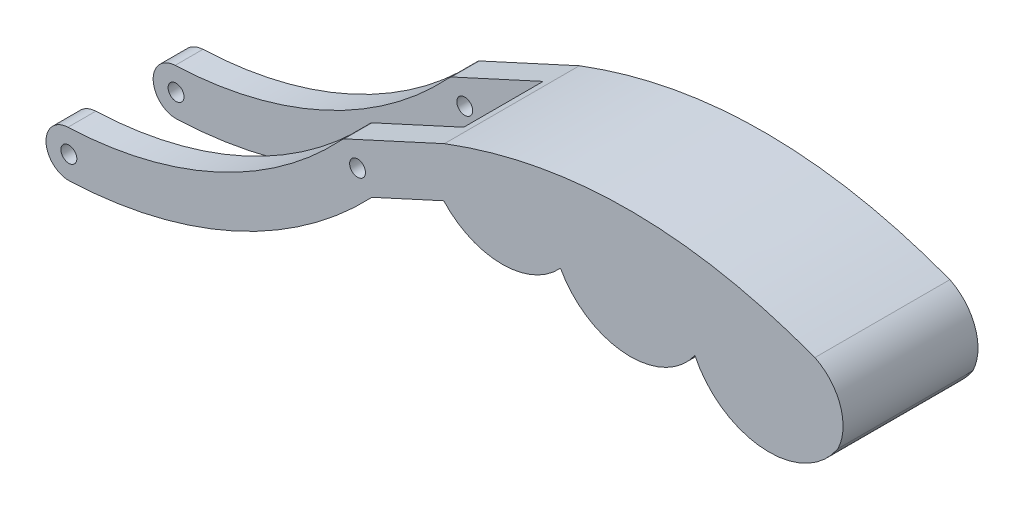
ISO-10303-21;
HEADER;
FILE_DESCRIPTION(('STEP AP214'),'2;1');
FILE_NAME('part.step','',(''),(''),'','','');
FILE_SCHEMA(('AUTOMOTIVE_DESIGN { 1 0 10303 214 1 1 1 1 }'));
ENDSEC;
DATA;
#1=APPLICATION_CONTEXT('core data for automotive mechanical design processes');
#2=APPLICATION_PROTOCOL_DEFINITION('international standard','automotive_design',2000,#1);
#3=PRODUCT_CONTEXT('',#1,'mechanical');
#4=PRODUCT('Part','Part','',(#3));
#5=PRODUCT_RELATED_PRODUCT_CATEGORY('part','',(#4));
#6=PRODUCT_DEFINITION_FORMATION('','',#4);
#7=PRODUCT_DEFINITION_CONTEXT('part definition',#1,'design');
#8=PRODUCT_DEFINITION('design','',#6,#7);
#9=PRODUCT_DEFINITION_SHAPE('','',#8);
#10=(LENGTH_UNIT() NAMED_UNIT(*) SI_UNIT(.MILLI.,.METRE.));
#11=(NAMED_UNIT(*) PLANE_ANGLE_UNIT() SI_UNIT($,.RADIAN.));
#12=(NAMED_UNIT(*) SI_UNIT($,.STERADIAN.) SOLID_ANGLE_UNIT());
#13=UNCERTAINTY_MEASURE_WITH_UNIT(LENGTH_MEASURE(1.E-05),#10,'distance_accuracy_value','');
#14=(GEOMETRIC_REPRESENTATION_CONTEXT(3) GLOBAL_UNCERTAINTY_ASSIGNED_CONTEXT((#13)) GLOBAL_UNIT_ASSIGNED_CONTEXT((#10,
#11,#12)) REPRESENTATION_CONTEXT('',''));
#15=CARTESIAN_POINT('',(0.,0.,0.));
#16=DIRECTION('',(0.,0.,1.));
#17=DIRECTION('',(1.,0.,0.));
#18=AXIS2_PLACEMENT_3D('',#15,#16,#17);
#19=CARTESIAN_POINT('',(-6.29132392811438,157.726048310342,51.));
#20=DIRECTION('',(0.,0.,-1.));
#21=DIRECTION('',(-0.999999999999998,0.,0.));
#22=AXIS2_PLACEMENT_3D('',#19,#20,#21);
#23=CYLINDRICAL_SURFACE('',#22,149.202972959832);
#24=CARTESIAN_POINT('',(-6.29132392811438,157.726048310342,40.5));
#25=DIRECTION('',(0.,0.,1.));
#26=DIRECTION('',(0.999999999999998,0.,0.));
#27=AXIS2_PLACEMENT_3D('',#24,#25,#26);
#28=CIRCLE('',#27,149.202972959832);
#29=CARTESIAN_POINT('',(-0.344694323235806,8.64162680227676,40.5));
#30=VERTEX_POINT('',#29);
#31=CARTESIAN_POINT('',(102.765670288736,55.9021849361896,40.5));
#32=VERTEX_POINT('',#31);
#33=EDGE_CURVE('E281',#30,#32,#28,.T.);
#34=ORIENTED_EDGE('',*,*,#33,.F.);
#35=DIRECTION('',(0.,0.,-1.));
#36=VECTOR('',#35,1.);
#37=CARTESIAN_POINT('',(-0.344694323235806,8.64162680227676,51.));
#38=LINE('',#37,#36);
#39=CARTESIAN_POINT('',(-0.344694323235806,8.64162680227676,51.));
#40=VERTEX_POINT('',#39);
#41=EDGE_CURVE('E56',#40,#30,#38,.T.);
#42=ORIENTED_EDGE('',*,*,#41,.F.);
#43=CARTESIAN_POINT('',(-6.29132392811438,157.726048310342,51.));
#44=DIRECTION('',(0.,0.,1.));
#45=DIRECTION('',(0.999999999999998,0.,0.));
#46=AXIS2_PLACEMENT_3D('',#43,#44,#45);
#47=CIRCLE('',#46,149.202972959832);
#48=CARTESIAN_POINT('',(102.765670288736,55.9021849361896,51.));
#49=VERTEX_POINT('',#48);
#50=EDGE_CURVE('E226',#40,#49,#47,.T.);
#51=ORIENTED_EDGE('',*,*,#50,.T.);
#52=DIRECTION('',(0.,0.,-1.));
#53=VECTOR('',#52,1.);
#54=CARTESIAN_POINT('',(102.765670288736,55.9021849361896,51.));
#55=LINE('',#54,#53);
#56=EDGE_CURVE('E227',#49,#32,#55,.T.);
#57=ORIENTED_EDGE('',*,*,#56,.T.);
#58=EDGE_LOOP('',(#34,#42,#51,#57));
#59=FACE_BOUND('',#58,.T.);
#60=ADVANCED_FACE('F48',(#59),#23,.F.);
#61=CARTESIAN_POINT('',(-1.11022302462516E-13,-2.22044604925031E-13,51.));
#62=DIRECTION('',(0.,0.,-1.));
#63=DIRECTION('',(-0.999999999999998,0.,0.));
#64=AXIS2_PLACEMENT_3D('',#61,#62,#63);
#65=CYLINDRICAL_SURFACE('',#64,8.64849859607463);
#66=ORIENTED_EDGE('',*,*,#41,.T.);
#67=CARTESIAN_POINT('',(-1.11022302462516E-13,-2.22044604925031E-13,40.5));
#68=DIRECTION('',(0.,0.,1.));
#69=DIRECTION('',(0.999999999999998,0.,0.));
#70=AXIS2_PLACEMENT_3D('',#67,#68,#69);
#71=CIRCLE('',#70,8.64849859607463);
#72=CARTESIAN_POINT('',(0.344694323235806,-8.64162680227731,40.5));
#73=VERTEX_POINT('',#72);
#74=EDGE_CURVE('E284',#30,#73,#71,.T.);
#75=ORIENTED_EDGE('',*,*,#74,.T.);
#76=DIRECTION('',(0.,0.,-1.));
#77=VECTOR('',#76,1.);
#78=CARTESIAN_POINT('',(0.344694323235806,-8.64162680227731,51.));
#79=LINE('',#78,#77);
#80=CARTESIAN_POINT('',(0.344694323235806,-8.64162680227731,51.));
#81=VERTEX_POINT('',#80);
#82=EDGE_CURVE('E251',#81,#73,#79,.T.);
#83=ORIENTED_EDGE('',*,*,#82,.F.);
#84=CARTESIAN_POINT('',(-1.11022302462516E-13,-2.22044604925031E-13,51.));
#85=DIRECTION('',(0.,0.,1.));
#86=DIRECTION('',(0.999999999999998,0.,0.));
#87=AXIS2_PLACEMENT_3D('',#84,#85,#86);
#88=CIRCLE('',#87,8.64849859607463);
#89=EDGE_CURVE('E302',#40,#81,#88,.T.);
#90=ORIENTED_EDGE('',*,*,#89,.F.);
#91=EDGE_LOOP('',(#66,#75,#83,#90));
#92=FACE_BOUND('',#91,.T.);
#93=ADVANCED_FACE('F382',(#92),#65,.T.);
#94=CARTESIAN_POINT('',(-6.29132392811438,157.726048310342,51.));
#95=DIRECTION('',(0.,0.,-1.));
#96=DIRECTION('',(-0.999999999999998,0.,0.));
#97=AXIS2_PLACEMENT_3D('',#94,#95,#96);
#98=CYLINDRICAL_SURFACE('',#97,166.499970151981);
#99=ORIENTED_EDGE('',*,*,#82,.T.);
#100=CARTESIAN_POINT('',(-6.29132392811438,157.726048310342,40.5));
#101=DIRECTION('',(0.,0.,1.));
#102=DIRECTION('',(0.999999999999998,0.,0.));
#103=AXIS2_PLACEMENT_3D('',#100,#101,#102);
#104=CIRCLE('',#103,166.499970151981);
#105=CARTESIAN_POINT('',(114.496565446833,43.1288151807596,40.5));
#106=VERTEX_POINT('',#105);
#107=EDGE_CURVE('E287',#73,#106,#104,.T.);
#108=ORIENTED_EDGE('',*,*,#107,.T.);
#109=DIRECTION('',(0.,0.,-1.));
#110=VECTOR('',#109,1.);
#111=CARTESIAN_POINT('',(114.496565446833,43.1288151807596,51.));
#112=LINE('',#111,#110);
#113=CARTESIAN_POINT('',(114.496565446833,43.1288151807596,51.));
#114=VERTEX_POINT('',#113);
#115=EDGE_CURVE('E247',#114,#106,#112,.T.);
#116=ORIENTED_EDGE('',*,*,#115,.F.);
#117=CARTESIAN_POINT('',(-6.29132392811438,157.726048310342,51.));
#118=DIRECTION('',(0.,0.,1.));
#119=DIRECTION('',(0.999999999999998,0.,0.));
#120=AXIS2_PLACEMENT_3D('',#117,#118,#119);
#121=CIRCLE('',#120,166.499970151981);
#122=EDGE_CURVE('E304',#81,#114,#121,.T.);
#123=ORIENTED_EDGE('',*,*,#122,.F.);
#124=EDGE_LOOP('',(#99,#108,#116,#123));
#125=FACE_BOUND('',#124,.T.);
#126=ADVANCED_FACE('F386',(#125),#98,.T.);
#127=CARTESIAN_POINT('',(3.54177078409457,-7.72723157194322,51.));
#128=DIRECTION('',(-0.416666666666664,0.909059342886308,0.));
#129=DIRECTION('',(-0.909059342886308,-0.416666666666664,0.));
#130=AXIS2_PLACEMENT_3D('',#127,#128,#129);
#131=PLANE('',#130);
#132=ORIENTED_EDGE('',*,*,#115,.T.);
#133=DIRECTION('',(0.909059342886308,0.416666666666664,0.));
#134=VECTOR('',#133,1.);
#135=CARTESIAN_POINT('',(3.54177078409457,-7.72723157194322,40.5));
#136=LINE('',#135,#134);
#137=CARTESIAN_POINT('',(141.660745716672,55.5794967939418,40.5));
#138=VERTEX_POINT('',#137);
#139=EDGE_CURVE('E290',#106,#138,#136,.T.);
#140=ORIENTED_EDGE('',*,*,#139,.T.);
#141=DIRECTION('',(0.,0.,-1.));
#142=VECTOR('',#141,1.);
#143=CARTESIAN_POINT('',(141.660745716672,55.5794967939418,51.));
#144=LINE('',#143,#142);
#145=CARTESIAN_POINT('',(141.660745716672,55.5794967939418,51.));
#146=VERTEX_POINT('',#145);
#147=EDGE_CURVE('E243',#146,#138,#144,.T.);
#148=ORIENTED_EDGE('',*,*,#147,.F.);
#149=DIRECTION('',(0.909059342886308,0.416666666666664,0.));
#150=VECTOR('',#149,1.);
#151=CARTESIAN_POINT('',(3.54177078409457,-7.72723157194322,51.));
#152=LINE('',#151,#150);
#153=EDGE_CURVE('E306',#114,#146,#152,.T.);
#154=ORIENTED_EDGE('',*,*,#153,.F.);
#155=EDGE_LOOP('',(#132,#140,#148,#154));
#156=FACE_BOUND('',#155,.T.);
#157=ADVANCED_FACE('F433',(#156),#131,.F.);
#158=CARTESIAN_POINT('',(0.,0.,51.));
#159=DIRECTION('',(0.,0.,-1.));
#160=DIRECTION('',(-0.999999999999998,0.,0.));
#161=AXIS2_PLACEMENT_3D('',#158,#159,#160);
#162=CYLINDRICAL_SURFACE('',#161,3.00000000000001);
#163=CARTESIAN_POINT('',(0.,0.,40.5));
#164=DIRECTION('',(0.,0.,1.));
#165=DIRECTION('',(0.999999999999998,0.,0.));
#166=AXIS2_PLACEMENT_3D('',#163,#164,#165);
#167=CIRCLE('',#166,3.00000000000001);
#168=CARTESIAN_POINT('',(3.,0.,40.5));
#169=VERTEX_POINT('',#168);
#170=EDGE_CURVE('E296',#169,#169,#167,.T.);
#171=ORIENTED_EDGE('',*,*,#170,.F.);
#172=EDGE_LOOP('',(#171));
#173=FACE_BOUND('',#172,.T.);
#174=CARTESIAN_POINT('',(0.,0.,51.));
#175=DIRECTION('',(0.,0.,1.));
#176=DIRECTION('',(0.999999999999998,0.,0.));
#177=AXIS2_PLACEMENT_3D('',#174,#175,#176);
#178=CIRCLE('',#177,3.00000000000001);
#179=CARTESIAN_POINT('',(3.,0.,51.));
#180=VERTEX_POINT('',#179);
#181=EDGE_CURVE('E176',#180,#180,#178,.T.);
#182=ORIENTED_EDGE('',*,*,#181,.T.);
#183=EDGE_LOOP('',(#182));
#184=FACE_BOUND('',#183,.T.);
#185=ADVANCED_FACE('F465',(#173,#184),#162,.F.);
#186=CARTESIAN_POINT('',(109.087121146357,49.9999999999995,51.));
#187=DIRECTION('',(0.,0.,-1.));
#188=DIRECTION('',(-0.999999999999998,0.,0.));
#189=AXIS2_PLACEMENT_3D('',#186,#187,#188);
#190=CYLINDRICAL_SURFACE('',#189,8.64849859607463);
#191=DIRECTION('',(0.,0.,-1.));
#192=VECTOR('',#191,1.);
#193=CARTESIAN_POINT('',(104.095898095928,57.0628762149119,51.));
#194=LINE('',#193,#192);
#195=CARTESIAN_POINT('',(104.095898095928,57.0628762149119,51.));
#196=VERTEX_POINT('',#195);
#197=CARTESIAN_POINT('',(104.095898095928,57.0628762149119,40.5));
#198=VERTEX_POINT('',#197);
#199=EDGE_CURVE('E163',#196,#198,#194,.T.);
#200=ORIENTED_EDGE('',*,*,#199,.T.);
#201=CARTESIAN_POINT('',(109.087121146357,49.9999999999995,40.5));
#202=DIRECTION('',(0.,0.,1.));
#203=DIRECTION('',(0.999999999999998,0.,0.));
#204=AXIS2_PLACEMENT_3D('',#201,#202,#203);
#205=CIRCLE('',#204,8.64849859607463);
#206=EDGE_CURVE('E262',#198,#32,#205,.T.);
#207=ORIENTED_EDGE('',*,*,#206,.T.);
#208=ORIENTED_EDGE('',*,*,#56,.F.);
#209=CARTESIAN_POINT('',(109.087121146357,49.9999999999995,51.));
#210=DIRECTION('',(0.,0.,1.));
#211=DIRECTION('',(0.999999999999998,0.,0.));
#212=AXIS2_PLACEMENT_3D('',#209,#210,#211);
#213=CIRCLE('',#212,8.64849859607463);
#214=EDGE_CURVE('E72',#196,#49,#213,.T.);
#215=ORIENTED_EDGE('',*,*,#214,.F.);
#216=EDGE_LOOP('',(#200,#207,#208,#215));
#217=FACE_BOUND('',#216,.T.);
#218=ADVANCED_FACE('F396',(#217),#190,.T.);
#219=CARTESIAN_POINT('',(109.087121146357,49.9999999999994,51.));
#220=DIRECTION('',(0.,0.,-1.));
#221=DIRECTION('',(-0.999999999999998,0.,0.));
#222=AXIS2_PLACEMENT_3D('',#219,#220,#221);
#223=CYLINDRICAL_SURFACE('',#222,3.00000000000001);
#224=CARTESIAN_POINT('',(109.087121146357,49.9999999999994,40.5));
#225=DIRECTION('',(0.,0.,1.));
#226=DIRECTION('',(0.999999999999998,0.,0.));
#227=AXIS2_PLACEMENT_3D('',#224,#225,#226);
#228=CIRCLE('',#227,3.00000000000001);
#229=CARTESIAN_POINT('',(112.087121146357,49.9999999999994,40.5));
#230=VERTEX_POINT('',#229);
#231=EDGE_CURVE('E260',#230,#230,#228,.T.);
#232=ORIENTED_EDGE('',*,*,#231,.F.);
#233=EDGE_LOOP('',(#232));
#234=FACE_BOUND('',#233,.T.);
#235=CARTESIAN_POINT('',(109.087121146357,49.9999999999994,51.));
#236=DIRECTION('',(0.,0.,1.));
#237=DIRECTION('',(0.999999999999998,0.,0.));
#238=AXIS2_PLACEMENT_3D('',#235,#236,#237);
#239=CIRCLE('',#238,3.00000000000001);
#240=CARTESIAN_POINT('',(112.087121146357,49.9999999999994,51.));
#241=VERTEX_POINT('',#240);
#242=EDGE_CURVE('E185',#241,#241,#239,.T.);
#243=ORIENTED_EDGE('',*,*,#242,.T.);
#244=EDGE_LOOP('',(#243));
#245=FACE_BOUND('',#244,.T.);
#246=ADVANCED_FACE('F390',(#234,#245),#223,.F.);
#247=CARTESIAN_POINT('',(-6.29132392811438,157.726048310342,10.5));
#248=DIRECTION('',(0.,0.,-1.));
#249=DIRECTION('',(-0.999999999999998,0.,0.));
#250=AXIS2_PLACEMENT_3D('',#247,#248,#249);
#251=CIRCLE('',#250,149.202972959832);
#252=CARTESIAN_POINT('',(102.765670288736,55.9021849361896,10.5));
#253=VERTEX_POINT('',#252);
#254=CARTESIAN_POINT('',(-0.344694323235806,8.64162680227676,10.5));
#255=VERTEX_POINT('',#254);
#256=EDGE_CURVE('E335',#253,#255,#251,.T.);
#257=ORIENTED_EDGE('',*,*,#256,.F.);
#258=CARTESIAN_POINT('',(102.765670288736,55.9021849361896,0.));
#259=VERTEX_POINT('',#258);
#260=EDGE_CURVE('E116',#253,#259,#55,.T.);
#261=ORIENTED_EDGE('',*,*,#260,.T.);
#262=CARTESIAN_POINT('',(-6.29132392811438,157.726048310342,0.));
#263=DIRECTION('',(0.,0.,1.));
#264=DIRECTION('',(0.999999999999998,0.,0.));
#265=AXIS2_PLACEMENT_3D('',#262,#263,#264);
#266=CIRCLE('',#265,149.202972959832);
#267=CARTESIAN_POINT('',(-0.344694323235806,8.64162680227676,0.));
#268=VERTEX_POINT('',#267);
#269=EDGE_CURVE('E188',#268,#259,#266,.T.);
#270=ORIENTED_EDGE('',*,*,#269,.F.);
#271=EDGE_CURVE('E254',#255,#268,#38,.T.);
#272=ORIENTED_EDGE('',*,*,#271,.F.);
#273=EDGE_LOOP('',(#257,#261,#270,#272));
#274=FACE_BOUND('',#273,.T.);
#275=ADVANCED_FACE('F50',(#274),#23,.F.);
#276=CARTESIAN_POINT('',(0.344694323235806,-8.64162680227731,10.5));
#277=VERTEX_POINT('',#276);
#278=CARTESIAN_POINT('',(0.344694323235806,-8.64162680227731,0.));
#279=VERTEX_POINT('',#278);
#280=EDGE_CURVE('E250',#277,#279,#79,.T.);
#281=ORIENTED_EDGE('',*,*,#280,.F.);
#282=CARTESIAN_POINT('',(-1.11022302462516E-13,-2.22044604925031E-13,10.5));
#283=DIRECTION('',(0.,0.,-1.));
#284=DIRECTION('',(-0.999999999999998,0.,0.));
#285=AXIS2_PLACEMENT_3D('',#282,#283,#284);
#286=CIRCLE('',#285,8.64849859607463);
#287=EDGE_CURVE('E342',#277,#255,#286,.T.);
#288=ORIENTED_EDGE('',*,*,#287,.T.);
#289=ORIENTED_EDGE('',*,*,#271,.T.);
#290=CARTESIAN_POINT('',(-1.11022302462516E-13,-2.22044604925031E-13,0.));
#291=DIRECTION('',(0.,0.,1.));
#292=DIRECTION('',(0.999999999999998,0.,0.));
#293=AXIS2_PLACEMENT_3D('',#290,#291,#292);
#294=CIRCLE('',#293,8.64849859607463);
#295=EDGE_CURVE('E191',#268,#279,#294,.T.);
#296=ORIENTED_EDGE('',*,*,#295,.T.);
#297=EDGE_LOOP('',(#281,#288,#289,#296));
#298=FACE_BOUND('',#297,.T.);
#299=ADVANCED_FACE('F388',(#298),#65,.T.);
#300=CARTESIAN_POINT('',(114.496565446833,43.1288151807596,10.5));
#301=VERTEX_POINT('',#300);
#302=CARTESIAN_POINT('',(114.496565446833,43.1288151807596,0.));
#303=VERTEX_POINT('',#302);
#304=EDGE_CURVE('E246',#301,#303,#112,.T.);
#305=ORIENTED_EDGE('',*,*,#304,.F.);
#306=CARTESIAN_POINT('',(-6.29132392811438,157.726048310342,10.5));
#307=DIRECTION('',(0.,0.,-1.));
#308=DIRECTION('',(-0.999999999999998,0.,0.));
#309=AXIS2_PLACEMENT_3D('',#306,#307,#308);
#310=CIRCLE('',#309,166.499970151981);
#311=EDGE_CURVE('E345',#301,#277,#310,.T.);
#312=ORIENTED_EDGE('',*,*,#311,.T.);
#313=ORIENTED_EDGE('',*,*,#280,.T.);
#314=CARTESIAN_POINT('',(-6.29132392811438,157.726048310342,0.));
#315=DIRECTION('',(0.,0.,1.));
#316=DIRECTION('',(0.999999999999998,0.,0.));
#317=AXIS2_PLACEMENT_3D('',#314,#315,#316);
#318=CIRCLE('',#317,166.499970151981);
#319=EDGE_CURVE('E195',#279,#303,#318,.T.);
#320=ORIENTED_EDGE('',*,*,#319,.T.);
#321=EDGE_LOOP('',(#305,#312,#313,#320));
#322=FACE_BOUND('',#321,.T.);
#323=ADVANCED_FACE('F360',(#322),#98,.T.);
#324=CARTESIAN_POINT('',(141.660745716672,55.5794967939418,10.5));
#325=VERTEX_POINT('',#324);
#326=CARTESIAN_POINT('',(141.660745716672,55.5794967939418,0.));
#327=VERTEX_POINT('',#326);
#328=EDGE_CURVE('E242',#325,#327,#144,.T.);
#329=ORIENTED_EDGE('',*,*,#328,.F.);
#330=DIRECTION('',(-0.909059342886308,-0.416666666666664,0.));
#331=VECTOR('',#330,1.);
#332=CARTESIAN_POINT('',(3.54177078409457,-7.72723157194322,10.5));
#333=LINE('',#332,#331);
#334=EDGE_CURVE('E275',#325,#301,#333,.T.);
#335=ORIENTED_EDGE('',*,*,#334,.T.);
#336=ORIENTED_EDGE('',*,*,#304,.T.);
#337=DIRECTION('',(0.909059342886308,0.416666666666664,0.));
#338=VECTOR('',#337,1.);
#339=CARTESIAN_POINT('',(3.54177078409457,-7.72723157194322,0.));
#340=LINE('',#339,#338);
#341=EDGE_CURVE('E198',#303,#327,#340,.T.);
#342=ORIENTED_EDGE('',*,*,#341,.T.);
#343=EDGE_LOOP('',(#329,#335,#336,#342));
#344=FACE_BOUND('',#343,.T.);
#345=ADVANCED_FACE('F353',(#344),#131,.F.);
#346=CARTESIAN_POINT('',(163.715018222085,75.6745486769835,51.));
#347=DIRECTION('',(0.,0.,-1.));
#348=DIRECTION('',(-0.999999999999998,0.,0.));
#349=AXIS2_PLACEMENT_3D('',#346,#347,#348);
#350=CYLINDRICAL_SURFACE('',#349,29.8362538855851);
#351=ORIENTED_EDGE('',*,*,#147,.T.);
#352=CARTESIAN_POINT('',(163.715018222085,75.6745486769835,40.5));
#353=DIRECTION('',(0.,0.,1.));
#354=DIRECTION('',(0.999999999999998,0.,0.));
#355=AXIS2_PLACEMENT_3D('',#352,#353,#354);
#356=CIRCLE('',#355,29.8362538855851);
#357=CARTESIAN_POINT('',(149.491883975899,49.4466151300935,40.5));
#358=VERTEX_POINT('',#357);
#359=EDGE_CURVE('E293',#138,#358,#356,.T.);
#360=ORIENTED_EDGE('',*,*,#359,.T.);
#361=DIRECTION('',(0.,0.,-1.));
#362=VECTOR('',#361,1.);
#363=CARTESIAN_POINT('',(149.491883975899,49.4466151300935,51.));
#364=LINE('',#363,#362);
#365=CARTESIAN_POINT('',(149.491883975899,49.4466151300935,10.5));
#366=VERTEX_POINT('',#365);
#367=EDGE_CURVE('E192',#358,#366,#364,.T.);
#368=ORIENTED_EDGE('',*,*,#367,.T.);
#369=CARTESIAN_POINT('',(163.715018222085,75.6745486769835,10.5));
#370=DIRECTION('',(0.,0.,-1.));
#371=DIRECTION('',(-0.999999999999998,0.,0.));
#372=AXIS2_PLACEMENT_3D('',#369,#370,#371);
#373=CIRCLE('',#372,29.8362538855851);
#374=EDGE_CURVE('E270',#366,#325,#373,.T.);
#375=ORIENTED_EDGE('',*,*,#374,.T.);
#376=ORIENTED_EDGE('',*,*,#328,.T.);
#377=CARTESIAN_POINT('',(163.715018222085,75.6745486769835,0.));
#378=DIRECTION('',(0.,0.,1.));
#379=DIRECTION('',(0.999999999999998,0.,0.));
#380=AXIS2_PLACEMENT_3D('',#377,#378,#379);
#381=CIRCLE('',#380,29.8362538855851);
#382=CARTESIAN_POINT('',(185.769290727497,55.5794967939423,0.));
#383=VERTEX_POINT('',#382);
#384=EDGE_CURVE('E201',#327,#383,#381,.T.);
#385=ORIENTED_EDGE('',*,*,#384,.T.);
#386=DIRECTION('',(0.,0.,-1.));
#387=VECTOR('',#386,1.);
#388=CARTESIAN_POINT('',(185.769290727497,55.5794967939423,51.));
#389=LINE('',#388,#387);
#390=CARTESIAN_POINT('',(185.769290727497,55.5794967939423,51.));
#391=VERTEX_POINT('',#390);
#392=EDGE_CURVE('E239',#391,#383,#389,.T.);
#393=ORIENTED_EDGE('',*,*,#392,.F.);
#394=CARTESIAN_POINT('',(163.715018222085,75.6745486769835,51.));
#395=DIRECTION('',(0.,0.,1.));
#396=DIRECTION('',(0.999999999999998,0.,0.));
#397=AXIS2_PLACEMENT_3D('',#394,#395,#396);
#398=CIRCLE('',#397,29.8362538855851);
#399=EDGE_CURVE('E308',#146,#391,#398,.T.);
#400=ORIENTED_EDGE('',*,*,#399,.F.);
#401=EDGE_LOOP('',(#351,#360,#368,#375,#376,#385,#393,#400));
#402=FACE_BOUND('',#401,.T.);
#403=ADVANCED_FACE('F369',(#402),#350,.T.);
#404=CARTESIAN_POINT('',(212.155670816656,69.8157215091365,51.));
#405=DIRECTION('',(0.,0.,-1.));
#406=DIRECTION('',(-0.999999999999998,0.,0.));
#407=AXIS2_PLACEMENT_3D('',#404,#405,#406);
#408=CYLINDRICAL_SURFACE('',#407,29.9818469803163);
#409=CARTESIAN_POINT('',(212.155670816656,69.8157215091365,0.));
#410=DIRECTION('',(0.,0.,1.));
#411=DIRECTION('',(0.999999999999998,0.,0.));
#412=AXIS2_PLACEMENT_3D('',#409,#410,#411);
#413=CIRCLE('',#412,29.9818469803163);
#414=CARTESIAN_POINT('',(236.569174779818,52.4119296064571,0.));
#415=VERTEX_POINT('',#414);
#416=EDGE_CURVE('E203',#383,#415,#413,.T.);
#417=ORIENTED_EDGE('',*,*,#416,.T.);
#418=DIRECTION('',(0.,0.,-1.));
#419=VECTOR('',#418,1.);
#420=CARTESIAN_POINT('',(236.569174779818,52.4119296064571,51.));
#421=LINE('',#420,#419);
#422=CARTESIAN_POINT('',(236.569174779818,52.4119296064571,51.));
#423=VERTEX_POINT('',#422);
#424=EDGE_CURVE('E236',#423,#415,#421,.T.);
#425=ORIENTED_EDGE('',*,*,#424,.F.);
#426=CARTESIAN_POINT('',(212.155670816656,69.8157215091365,51.));
#427=DIRECTION('',(0.,0.,1.));
#428=DIRECTION('',(0.999999999999998,0.,0.));
#429=AXIS2_PLACEMENT_3D('',#426,#427,#428);
#430=CIRCLE('',#429,29.9818469803163);
#431=EDGE_CURVE('E310',#391,#423,#430,.T.);
#432=ORIENTED_EDGE('',*,*,#431,.F.);
#433=ORIENTED_EDGE('',*,*,#392,.T.);
#434=EDGE_LOOP('',(#417,#425,#432,#433));
#435=FACE_BOUND('',#434,.T.);
#436=ADVANCED_FACE('F372',(#435),#408,.T.);
#437=CARTESIAN_POINT('',(264.561483982287,65.8243253508141,51.));
#438=DIRECTION('',(0.,0.,-1.));
#439=DIRECTION('',(-0.999999999999998,0.,0.));
#440=AXIS2_PLACEMENT_3D('',#437,#438,#439);
#441=CYLINDRICAL_SURFACE('',#440,31.039679993354);
#442=CARTESIAN_POINT('',(264.561483982287,65.8243253508141,0.));
#443=DIRECTION('',(0.,0.,1.));
#444=DIRECTION('',(0.999999999999998,0.,0.));
#445=AXIS2_PLACEMENT_3D('',#442,#443,#444);
#446=CIRCLE('',#445,31.039679993354);
#447=CARTESIAN_POINT('',(290.598242924557,48.9261326109995,0.));
#448=VERTEX_POINT('',#447);
#449=EDGE_CURVE('E205',#415,#448,#446,.T.);
#450=ORIENTED_EDGE('',*,*,#449,.T.);
#451=DIRECTION('',(0.,0.,-1.));
#452=VECTOR('',#451,1.);
#453=CARTESIAN_POINT('',(290.598242924557,48.9261326109995,51.));
#454=LINE('',#453,#452);
#455=CARTESIAN_POINT('',(290.598242924557,48.9261326109995,51.));
#456=VERTEX_POINT('',#455);
#457=EDGE_CURVE('E233',#456,#448,#454,.T.);
#458=ORIENTED_EDGE('',*,*,#457,.F.);
#459=CARTESIAN_POINT('',(264.561483982287,65.8243253508141,51.));
#460=DIRECTION('',(0.,0.,1.));
#461=DIRECTION('',(0.999999999999998,0.,0.));
#462=AXIS2_PLACEMENT_3D('',#459,#460,#461);
#463=CIRCLE('',#462,31.039679993354);
#464=EDGE_CURVE('E312',#423,#456,#463,.T.);
#465=ORIENTED_EDGE('',*,*,#464,.F.);
#466=ORIENTED_EDGE('',*,*,#424,.T.);
#467=EDGE_LOOP('',(#450,#458,#465,#466));
#468=FACE_BOUND('',#467,.T.);
#469=ADVANCED_FACE('F318',(#468),#441,.T.);
#470=CARTESIAN_POINT('',(273.51910068733,57.3147560013825,51.));
#471=DIRECTION('',(0.,0.,-1.));
#472=DIRECTION('',(-0.999999999999998,0.,0.));
#473=AXIS2_PLACEMENT_3D('',#470,#471,#472);
#474=CYLINDRICAL_SURFACE('',#473,19.0280346316984);
#475=CARTESIAN_POINT('',(273.51910068733,57.3147560013825,0.));
#476=DIRECTION('',(0.,0.,1.));
#477=DIRECTION('',(0.999999999999998,0.,0.));
#478=AXIS2_PLACEMENT_3D('',#475,#476,#477);
#479=CIRCLE('',#478,19.0280346316984);
#480=CARTESIAN_POINT('',(281.907724077714,74.3938982386094,0.));
#481=VERTEX_POINT('',#480);
#482=EDGE_CURVE('E207',#448,#481,#479,.T.);
#483=ORIENTED_EDGE('',*,*,#482,.T.);
#484=DIRECTION('',(0.,0.,-1.));
#485=VECTOR('',#484,1.);
#486=CARTESIAN_POINT('',(281.907724077714,74.3938982386094,51.));
#487=LINE('',#486,#485);
#488=CARTESIAN_POINT('',(281.907724077714,74.3938982386094,51.));
#489=VERTEX_POINT('',#488);
#490=EDGE_CURVE('E162',#489,#481,#487,.T.);
#491=ORIENTED_EDGE('',*,*,#490,.F.);
#492=CARTESIAN_POINT('',(273.51910068733,57.3147560013825,51.));
#493=DIRECTION('',(0.,0.,1.));
#494=DIRECTION('',(0.999999999999998,0.,0.));
#495=AXIS2_PLACEMENT_3D('',#492,#493,#494);
#496=CIRCLE('',#495,19.0280346316984);
#497=EDGE_CURVE('E169',#456,#489,#496,.T.);
#498=ORIENTED_EDGE('',*,*,#497,.F.);
#499=ORIENTED_EDGE('',*,*,#457,.T.);
#500=EDGE_LOOP('',(#483,#491,#498,#499));
#501=FACE_BOUND('',#500,.T.);
#502=ADVANCED_FACE('F322',(#501),#474,.T.);
#503=CARTESIAN_POINT('',(141.907724077714,74.3938982386095,51.));
#504=CARTESIAN_POINT('',(211.705167046837,100.839206128298,51.));
#505=CARTESIAN_POINT('',(281.907724077714,74.3938982386094,51.));
#506=B_SPLINE_CURVE_WITH_KNOTS('',2,(#503,#504,#505),.UNSPECIFIED.,.F.,.F.,(3,3),(0.,1.),.UNSPECIFIED.);
#507=DIRECTION('',(0.,0.,-1.));
#508=VECTOR('',#507,1.);
#509=SURFACE_OF_LINEAR_EXTRUSION('',#506,#508);
#510=CARTESIAN_POINT('',(141.907724077714,74.3938982386095,0.));
#511=CARTESIAN_POINT('',(211.705167046837,100.839206128298,0.));
#512=CARTESIAN_POINT('',(281.907724077714,74.3938982386094,0.));
#513=B_SPLINE_CURVE_WITH_KNOTS('',2,(#510,#511,#512),.UNSPECIFIED.,.F.,.F.,(3,3),(0.,1.),.UNSPECIFIED.);
#514=CARTESIAN_POINT('',(141.907724077714,74.3938982386095,0.));
#515=VERTEX_POINT('',#514);
#516=EDGE_CURVE('E157',#515,#481,#513,.T.);
#517=ORIENTED_EDGE('',*,*,#516,.F.);
#518=DIRECTION('',(0.,0.,-1.));
#519=VECTOR('',#518,1.);
#520=CARTESIAN_POINT('',(141.907724077714,74.3938982386095,51.));
#521=LINE('',#520,#519);
#522=CARTESIAN_POINT('',(141.907724077714,74.3938982386095,51.));
#523=VERTEX_POINT('',#522);
#524=EDGE_CURVE('E152',#523,#515,#521,.T.);
#525=ORIENTED_EDGE('',*,*,#524,.F.);
#526=EDGE_CURVE('E155',#523,#489,#506,.T.);
#527=ORIENTED_EDGE('',*,*,#526,.T.);
#528=ORIENTED_EDGE('',*,*,#490,.T.);
#529=EDGE_LOOP('',(#517,#525,#527,#528));
#530=FACE_BOUND('',#529,.T.);
#531=ADVANCED_FACE('F154',(#530),#509,.T.);
#532=CARTESIAN_POINT('',(-3.54177078409468,7.72723157194333,51.));
#533=DIRECTION('',(-0.416666666666665,0.909059342886307,0.));
#534=DIRECTION('',(-0.909059342886308,-0.416666666666666,0.));
#535=AXIS2_PLACEMENT_3D('',#532,#533,#534);
#536=PLANE('',#535);
#537=DIRECTION('',(0.909059342886308,0.416666666666666,0.));
#538=VECTOR('',#537,1.);
#539=CARTESIAN_POINT('',(-3.54177078409468,7.72723157194333,40.5));
#540=LINE('',#539,#538);
#541=CARTESIAN_POINT('',(138.725789220203,72.9354607878486,40.5));
#542=VERTEX_POINT('',#541);
#543=EDGE_CURVE('E267',#198,#542,#540,.T.);
#544=ORIENTED_EDGE('',*,*,#543,.F.);
#545=ORIENTED_EDGE('',*,*,#199,.F.);
#546=DIRECTION('',(0.909059342886308,0.416666666666666,0.));
#547=VECTOR('',#546,1.);
#548=CARTESIAN_POINT('',(-3.54177078409468,7.72723157194333,51.));
#549=LINE('',#548,#547);
#550=EDGE_CURVE('E167',#196,#523,#549,.T.);
#551=ORIENTED_EDGE('',*,*,#550,.T.);
#552=ORIENTED_EDGE('',*,*,#524,.T.);
#553=DIRECTION('',(0.909059342886308,0.416666666666666,0.));
#554=VECTOR('',#553,1.);
#555=CARTESIAN_POINT('',(-3.54177078409468,7.72723157194333,0.));
#556=LINE('',#555,#554);
#557=CARTESIAN_POINT('',(104.095898095928,57.0628762149119,0.));
#558=VERTEX_POINT('',#557);
#559=EDGE_CURVE('E213',#558,#515,#556,.T.);
#560=ORIENTED_EDGE('',*,*,#559,.F.);
#561=CARTESIAN_POINT('',(104.095898095928,57.0628762149119,10.5));
#562=VERTEX_POINT('',#561);
#563=EDGE_CURVE('E230',#562,#558,#194,.T.);
#564=ORIENTED_EDGE('',*,*,#563,.F.);
#565=DIRECTION('',(-0.909059342886308,-0.416666666666666,0.));
#566=VECTOR('',#565,1.);
#567=CARTESIAN_POINT('',(-3.54177078409468,7.72723157194333,10.5));
#568=LINE('',#567,#566);
#569=CARTESIAN_POINT('',(138.725789220203,72.9354607878486,10.5));
#570=VERTEX_POINT('',#569);
#571=EDGE_CURVE('E63',#570,#562,#568,.T.);
#572=ORIENTED_EDGE('',*,*,#571,.F.);
#573=DIRECTION('',(0.,0.,-1.));
#574=VECTOR('',#573,1.);
#575=CARTESIAN_POINT('',(138.725789220203,72.9354607878486,51.));
#576=LINE('',#575,#574);
#577=EDGE_CURVE('E13',#542,#570,#576,.T.);
#578=ORIENTED_EDGE('',*,*,#577,.F.);
#579=EDGE_LOOP('',(#544,#545,#551,#552,#560,#564,#572,#578));
#580=FACE_BOUND('',#579,.T.);
#581=ADVANCED_FACE('F173',(#580),#536,.T.);
#582=CARTESIAN_POINT('',(0.,0.,10.5));
#583=DIRECTION('',(0.,0.,-1.));
#584=DIRECTION('',(-0.999999999999998,0.,0.));
#585=AXIS2_PLACEMENT_3D('',#582,#583,#584);
#586=CIRCLE('',#585,3.00000000000001);
#587=CARTESIAN_POINT('',(-3.,0.,10.5));
#588=VERTEX_POINT('',#587);
#589=EDGE_CURVE('E263',#588,#588,#586,.T.);
#590=ORIENTED_EDGE('',*,*,#589,.F.);
#591=EDGE_LOOP('',(#590));
#592=FACE_BOUND('',#591,.T.);
#593=CARTESIAN_POINT('',(0.,0.,0.));
#594=DIRECTION('',(0.,0.,1.));
#595=DIRECTION('',(0.999999999999998,0.,0.));
#596=AXIS2_PLACEMENT_3D('',#593,#594,#595);
#597=CIRCLE('',#596,3.00000000000001);
#598=CARTESIAN_POINT('',(3.,0.,0.));
#599=VERTEX_POINT('',#598);
#600=EDGE_CURVE('E220',#599,#599,#597,.T.);
#601=ORIENTED_EDGE('',*,*,#600,.F.);
#602=EDGE_LOOP('',(#601));
#603=FACE_BOUND('',#602,.T.);
#604=ADVANCED_FACE('F461',(#592,#603),#162,.F.);
#605=ORIENTED_EDGE('',*,*,#260,.F.);
#606=CARTESIAN_POINT('',(109.087121146357,49.9999999999995,10.5));
#607=DIRECTION('',(0.,0.,-1.));
#608=DIRECTION('',(-0.999999999999998,0.,0.));
#609=AXIS2_PLACEMENT_3D('',#606,#607,#608);
#610=CIRCLE('',#609,8.64849859607463);
#611=EDGE_CURVE('E258',#253,#562,#610,.T.);
#612=ORIENTED_EDGE('',*,*,#611,.T.);
#613=ORIENTED_EDGE('',*,*,#563,.T.);
#614=CARTESIAN_POINT('',(109.087121146357,49.9999999999995,0.));
#615=DIRECTION('',(0.,0.,1.));
#616=DIRECTION('',(0.999999999999998,0.,0.));
#617=AXIS2_PLACEMENT_3D('',#614,#615,#616);
#618=CIRCLE('',#617,8.64849859607463);
#619=EDGE_CURVE('E218',#558,#259,#618,.T.);
#620=ORIENTED_EDGE('',*,*,#619,.T.);
#621=EDGE_LOOP('',(#605,#612,#613,#620));
#622=FACE_BOUND('',#621,.T.);
#623=ADVANCED_FACE('F331',(#622),#190,.T.);
#624=CARTESIAN_POINT('',(109.087121146357,49.9999999999994,10.5));
#625=DIRECTION('',(0.,0.,-1.));
#626=DIRECTION('',(-0.999999999999998,0.,0.));
#627=AXIS2_PLACEMENT_3D('',#624,#625,#626);
#628=CIRCLE('',#627,3.00000000000001);
#629=CARTESIAN_POINT('',(106.087121146357,49.9999999999994,10.5));
#630=VERTEX_POINT('',#629);
#631=EDGE_CURVE('E256',#630,#630,#628,.T.);
#632=ORIENTED_EDGE('',*,*,#631,.F.);
#633=EDGE_LOOP('',(#632));
#634=FACE_BOUND('',#633,.T.);
#635=CARTESIAN_POINT('',(109.087121146357,49.9999999999994,0.));
#636=DIRECTION('',(0.,0.,1.));
#637=DIRECTION('',(0.999999999999998,0.,0.));
#638=AXIS2_PLACEMENT_3D('',#635,#636,#637);
#639=CIRCLE('',#638,3.00000000000001);
#640=CARTESIAN_POINT('',(112.087121146357,49.9999999999994,0.));
#641=VERTEX_POINT('',#640);
#642=EDGE_CURVE('E223',#641,#641,#639,.T.);
#643=ORIENTED_EDGE('',*,*,#642,.F.);
#644=EDGE_LOOP('',(#643));
#645=FACE_BOUND('',#644,.T.);
#646=ADVANCED_FACE('F399',(#634,#645),#223,.F.);
#647=CARTESIAN_POINT('',(0.,0.,51.));
#648=DIRECTION('',(0.,0.,1.));
#649=DIRECTION('',(0.999999999999998,0.,0.));
#650=AXIS2_PLACEMENT_3D('',#647,#648,#649);
#651=PLANE('',#650);
#652=ORIENTED_EDGE('',*,*,#50,.F.);
#653=ORIENTED_EDGE('',*,*,#89,.T.);
#654=ORIENTED_EDGE('',*,*,#122,.T.);
#655=ORIENTED_EDGE('',*,*,#153,.T.);
#656=ORIENTED_EDGE('',*,*,#399,.T.);
#657=ORIENTED_EDGE('',*,*,#431,.T.);
#658=ORIENTED_EDGE('',*,*,#464,.T.);
#659=ORIENTED_EDGE('',*,*,#497,.T.);
#660=ORIENTED_EDGE('',*,*,#526,.F.);
#661=ORIENTED_EDGE('',*,*,#550,.F.);
#662=ORIENTED_EDGE('',*,*,#214,.T.);
#663=EDGE_LOOP('',(#652,#653,#654,#655,#656,#657,#658,#659,#660,#661,#662));
#664=FACE_BOUND('',#663,.T.);
#665=ORIENTED_EDGE('',*,*,#181,.F.);
#666=EDGE_LOOP('',(#665));
#667=FACE_BOUND('',#666,.T.);
#668=ORIENTED_EDGE('',*,*,#242,.F.);
#669=EDGE_LOOP('',(#668));
#670=FACE_BOUND('',#669,.T.);
#671=ADVANCED_FACE('F165',(#664,#667,#670),#651,.T.);
#672=CARTESIAN_POINT('',(0.,0.,0.));
#673=DIRECTION('',(0.,0.,1.));
#674=DIRECTION('',(0.999999999999998,0.,0.));
#675=AXIS2_PLACEMENT_3D('',#672,#673,#674);
#676=PLANE('',#675);
#677=ORIENTED_EDGE('',*,*,#269,.T.);
#678=ORIENTED_EDGE('',*,*,#619,.F.);
#679=ORIENTED_EDGE('',*,*,#559,.T.);
#680=ORIENTED_EDGE('',*,*,#516,.T.);
#681=ORIENTED_EDGE('',*,*,#482,.F.);
#682=ORIENTED_EDGE('',*,*,#449,.F.);
#683=ORIENTED_EDGE('',*,*,#416,.F.);
#684=ORIENTED_EDGE('',*,*,#384,.F.);
#685=ORIENTED_EDGE('',*,*,#341,.F.);
#686=ORIENTED_EDGE('',*,*,#319,.F.);
#687=ORIENTED_EDGE('',*,*,#295,.F.);
#688=EDGE_LOOP('',(#677,#678,#679,#680,#681,#682,#683,#684,#685,#686,#687));
#689=FACE_BOUND('',#688,.T.);
#690=ORIENTED_EDGE('',*,*,#600,.T.);
#691=EDGE_LOOP('',(#690));
#692=FACE_BOUND('',#691,.T.);
#693=ORIENTED_EDGE('',*,*,#642,.T.);
#694=EDGE_LOOP('',(#693));
#695=FACE_BOUND('',#694,.T.);
#696=ADVANCED_FACE('F324',(#689,#692,#695),#676,.F.);
#697=CARTESIAN_POINT('',(196.332825907199,-52.7482550112908,10.5));
#698=DIRECTION('',(0.909059342886307,0.416666666666666,0.));
#699=DIRECTION('',(-0.416666666666666,0.909059342886307,0.));
#700=AXIS2_PLACEMENT_3D('',#697,#698,#699);
#701=PLANE('',#700);
#702=DIRECTION('',(-0.416666666666666,0.909059342886307,0.));
#703=VECTOR('',#702,1.);
#704=CARTESIAN_POINT('',(196.332825907199,-52.7482550112908,40.5));
#705=LINE('',#704,#703);
#706=EDGE_CURVE('E259',#358,#542,#705,.T.);
#707=ORIENTED_EDGE('',*,*,#706,.T.);
#708=ORIENTED_EDGE('',*,*,#577,.T.);
#709=DIRECTION('',(-0.416666666666666,0.909059342886307,0.));
#710=VECTOR('',#709,1.);
#711=CARTESIAN_POINT('',(196.332825907199,-52.7482550112908,10.5));
#712=LINE('',#711,#710);
#713=EDGE_CURVE('E338',#366,#570,#712,.T.);
#714=ORIENTED_EDGE('',*,*,#713,.F.);
#715=ORIENTED_EDGE('',*,*,#367,.F.);
#716=EDGE_LOOP('',(#707,#708,#714,#715));
#717=FACE_BOUND('',#716,.T.);
#718=ADVANCED_FACE('F442',(#717),#701,.F.);
#719=CARTESIAN_POINT('',(-103.656757245283,-190.248255011291,40.5));
#720=DIRECTION('',(0.,0.,1.));
#721=DIRECTION('',(0.999999999999998,0.,0.));
#722=AXIS2_PLACEMENT_3D('',#719,#720,#721);
#723=PLANE('',#722);
#724=ORIENTED_EDGE('',*,*,#170,.T.);
#725=EDGE_LOOP('',(#724));
#726=FACE_BOUND('',#725,.T.);
#727=ORIENTED_EDGE('',*,*,#231,.T.);
#728=EDGE_LOOP('',(#727));
#729=FACE_BOUND('',#728,.T.);
#730=ORIENTED_EDGE('',*,*,#139,.F.);
#731=ORIENTED_EDGE('',*,*,#107,.F.);
#732=ORIENTED_EDGE('',*,*,#74,.F.);
#733=ORIENTED_EDGE('',*,*,#33,.T.);
#734=ORIENTED_EDGE('',*,*,#206,.F.);
#735=ORIENTED_EDGE('',*,*,#543,.T.);
#736=ORIENTED_EDGE('',*,*,#706,.F.);
#737=ORIENTED_EDGE('',*,*,#359,.F.);
#738=EDGE_LOOP('',(#730,#731,#732,#733,#734,#735,#736,#737));
#739=FACE_BOUND('',#738,.T.);
#740=ADVANCED_FACE('F429',(#726,#729,#739),#723,.F.);
#741=CARTESIAN_POINT('',(-103.656757245283,-190.248255011291,10.5));
#742=DIRECTION('',(0.,0.,-1.));
#743=DIRECTION('',(-0.999999999999998,0.,0.));
#744=AXIS2_PLACEMENT_3D('',#741,#742,#743);
#745=PLANE('',#744);
#746=ORIENTED_EDGE('',*,*,#589,.T.);
#747=EDGE_LOOP('',(#746));
#748=FACE_BOUND('',#747,.T.);
#749=ORIENTED_EDGE('',*,*,#631,.T.);
#750=EDGE_LOOP('',(#749));
#751=FACE_BOUND('',#750,.T.);
#752=ORIENTED_EDGE('',*,*,#713,.T.);
#753=ORIENTED_EDGE('',*,*,#571,.T.);
#754=ORIENTED_EDGE('',*,*,#611,.F.);
#755=ORIENTED_EDGE('',*,*,#256,.T.);
#756=ORIENTED_EDGE('',*,*,#287,.F.);
#757=ORIENTED_EDGE('',*,*,#311,.F.);
#758=ORIENTED_EDGE('',*,*,#334,.F.);
#759=ORIENTED_EDGE('',*,*,#374,.F.);
#760=EDGE_LOOP('',(#752,#753,#754,#755,#756,#757,#758,#759));
#761=FACE_BOUND('',#760,.T.);
#762=ADVANCED_FACE('F404',(#748,#751,#761),#745,.F.);
#763=CLOSED_SHELL('',(#60,#93,#126,#157,#185,#218,#246,#275,#299,#323,#345,#403,#436,#469,#502,
#531,#581,#604,#623,#646,#671,#696,#718,#740,#762));
#764=MANIFOLD_SOLID_BREP('B2',#763);
#765=ADVANCED_BREP_SHAPE_REPRESENTATION('',(#18,#764),#14);
#766=SHAPE_DEFINITION_REPRESENTATION(#9,#765);
ENDSEC;
END-ISO-10303-21;
